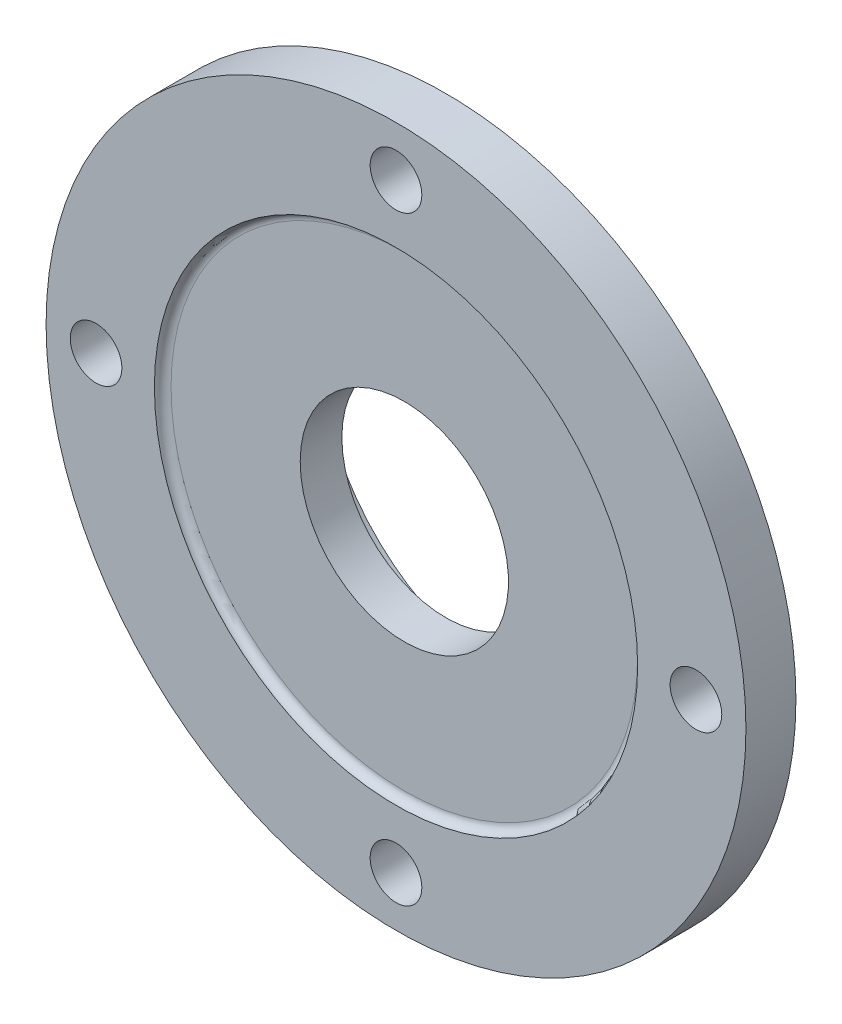
ISO-10303-21;
HEADER;
FILE_DESCRIPTION(('STEP AP214'),'2;1');
FILE_NAME('part.step','',(''),(''),'','','');
FILE_SCHEMA(('AUTOMOTIVE_DESIGN { 1 0 10303 214 1 1 1 1 }'));
ENDSEC;
DATA;
#1=APPLICATION_CONTEXT('core data for automotive mechanical design processes');
#2=APPLICATION_PROTOCOL_DEFINITION('international standard','automotive_design',2000,#1);
#3=PRODUCT_CONTEXT('',#1,'mechanical');
#4=PRODUCT('Part','Part','',(#3));
#5=PRODUCT_RELATED_PRODUCT_CATEGORY('part','',(#4));
#6=PRODUCT_DEFINITION_FORMATION('','',#4);
#7=PRODUCT_DEFINITION_CONTEXT('part definition',#1,'design');
#8=PRODUCT_DEFINITION('design','',#6,#7);
#9=PRODUCT_DEFINITION_SHAPE('','',#8);
#10=(LENGTH_UNIT() NAMED_UNIT(*) SI_UNIT(.MILLI.,.METRE.));
#11=(NAMED_UNIT(*) PLANE_ANGLE_UNIT() SI_UNIT($,.RADIAN.));
#12=(NAMED_UNIT(*) SI_UNIT($,.STERADIAN.) SOLID_ANGLE_UNIT());
#13=UNCERTAINTY_MEASURE_WITH_UNIT(LENGTH_MEASURE(1.E-05),#10,'distance_accuracy_value','');
#14=(GEOMETRIC_REPRESENTATION_CONTEXT(3) GLOBAL_UNCERTAINTY_ASSIGNED_CONTEXT((#13)) GLOBAL_UNIT_ASSIGNED_CONTEXT((#10,
#11,#12)) REPRESENTATION_CONTEXT('',''));
#15=CARTESIAN_POINT('',(0.,0.,0.));
#16=DIRECTION('',(0.,0.,1.));
#17=DIRECTION('',(1.,0.,0.));
#18=AXIS2_PLACEMENT_3D('',#15,#16,#17);
#19=CARTESIAN_POINT('',(0.,0.,6.));
#20=DIRECTION('',(0.,0.,1.));
#21=DIRECTION('',(1.,0.,0.));
#22=AXIS2_PLACEMENT_3D('',#19,#20,#21);
#23=PLANE('',#22);
#24=CARTESIAN_POINT('',(0.,0.,6.));
#25=DIRECTION('',(0.,0.,1.));
#26=DIRECTION('',(1.,0.,0.));
#27=AXIS2_PLACEMENT_3D('',#24,#25,#26);
#28=CIRCLE('',#27,29.);
#29=CARTESIAN_POINT('',(29.,0.,6.));
#30=VERTEX_POINT('',#29);
#31=EDGE_CURVE('E107',#30,#30,#28,.T.);
#32=ORIENTED_EDGE('',*,*,#31,.F.);
#33=EDGE_LOOP('',(#32));
#34=FACE_BOUND('',#33,.T.);
#35=CARTESIAN_POINT('',(-2.51386656396706E-13,-36.,6.));
#36=DIRECTION('',(0.,0.,1.));
#37=DIRECTION('',(1.,0.,0.));
#38=AXIS2_PLACEMENT_3D('',#35,#36,#37);
#39=CIRCLE('',#38,3.1);
#40=CARTESIAN_POINT('',(3.09999999999975,-36.,6.));
#41=VERTEX_POINT('',#40);
#42=EDGE_CURVE('E91',#41,#41,#39,.T.);
#43=ORIENTED_EDGE('',*,*,#42,.F.);
#44=EDGE_LOOP('',(#43));
#45=FACE_BOUND('',#44,.T.);
#46=CARTESIAN_POINT('',(0.,36.,6.));
#47=DIRECTION('',(0.,0.,1.));
#48=DIRECTION('',(1.,0.,0.));
#49=AXIS2_PLACEMENT_3D('',#46,#47,#48);
#50=CIRCLE('',#49,3.1);
#51=CARTESIAN_POINT('',(3.1,36.,6.));
#52=VERTEX_POINT('',#51);
#53=EDGE_CURVE('E75',#52,#52,#50,.T.);
#54=ORIENTED_EDGE('',*,*,#53,.F.);
#55=EDGE_LOOP('',(#54));
#56=FACE_BOUND('',#55,.T.);
#57=CARTESIAN_POINT('',(0.,0.,6.));
#58=DIRECTION('',(0.,0.,1.));
#59=DIRECTION('',(1.,0.,0.));
#60=AXIS2_PLACEMENT_3D('',#57,#58,#59);
#61=CIRCLE('',#60,42.);
#62=CARTESIAN_POINT('',(42.,0.,6.));
#63=VERTEX_POINT('',#62);
#64=EDGE_CURVE('E70',#63,#63,#61,.T.);
#65=ORIENTED_EDGE('',*,*,#64,.T.);
#66=EDGE_LOOP('',(#65));
#67=FACE_BOUND('',#66,.T.);
#68=CARTESIAN_POINT('',(36.,-1.25693328198353E-13,6.));
#69=DIRECTION('',(0.,0.,1.));
#70=DIRECTION('',(1.,0.,0.));
#71=AXIS2_PLACEMENT_3D('',#68,#69,#70);
#72=CIRCLE('',#71,3.1);
#73=CARTESIAN_POINT('',(39.1,-1.25693328198353E-13,6.));
#74=VERTEX_POINT('',#73);
#75=EDGE_CURVE('E83',#74,#74,#72,.T.);
#76=ORIENTED_EDGE('',*,*,#75,.F.);
#77=EDGE_LOOP('',(#76));
#78=FACE_BOUND('',#77,.T.);
#79=CARTESIAN_POINT('',(-36.,3.77079984595058E-13,6.));
#80=DIRECTION('',(0.,0.,1.));
#81=DIRECTION('',(1.,0.,0.));
#82=AXIS2_PLACEMENT_3D('',#79,#80,#81);
#83=CIRCLE('',#82,3.1);
#84=CARTESIAN_POINT('',(-32.9,3.77079984595058E-13,6.));
#85=VERTEX_POINT('',#84);
#86=EDGE_CURVE('E99',#85,#85,#83,.T.);
#87=ORIENTED_EDGE('',*,*,#86,.F.);
#88=EDGE_LOOP('',(#87));
#89=FACE_BOUND('',#88,.T.);
#90=ADVANCED_FACE('F45',(#34,#45,#56,#67,#78,#89),#23,.T.);
#91=CARTESIAN_POINT('',(0.,0.,0.));
#92=DIRECTION('',(0.,0.,1.));
#93=DIRECTION('',(1.,0.,0.));
#94=AXIS2_PLACEMENT_3D('',#91,#92,#93);
#95=PLANE('',#94);
#96=CARTESIAN_POINT('',(0.,0.,0.));
#97=DIRECTION('',(0.,0.,1.));
#98=DIRECTION('',(1.,0.,0.));
#99=AXIS2_PLACEMENT_3D('',#96,#97,#98);
#100=CIRCLE('',#99,29.);
#101=CARTESIAN_POINT('',(29.,0.,0.));
#102=VERTEX_POINT('',#101);
#103=EDGE_CURVE('E60',#102,#102,#100,.F.);
#104=ORIENTED_EDGE('',*,*,#103,.F.);
#105=EDGE_LOOP('',(#104));
#106=FACE_BOUND('',#105,.T.);
#107=CARTESIAN_POINT('',(0.,0.,0.));
#108=DIRECTION('',(0.,0.,1.));
#109=DIRECTION('',(1.,0.,0.));
#110=AXIS2_PLACEMENT_3D('',#107,#108,#109);
#111=CIRCLE('',#110,42.);
#112=CARTESIAN_POINT('',(42.,0.,0.));
#113=VERTEX_POINT('',#112);
#114=EDGE_CURVE('E71',#113,#113,#111,.T.);
#115=ORIENTED_EDGE('',*,*,#114,.F.);
#116=EDGE_LOOP('',(#115));
#117=FACE_BOUND('',#116,.T.);
#118=CARTESIAN_POINT('',(0.,36.,0.));
#119=DIRECTION('',(0.,0.,1.));
#120=DIRECTION('',(1.,0.,0.));
#121=AXIS2_PLACEMENT_3D('',#118,#119,#120);
#122=CIRCLE('',#121,3.1);
#123=CARTESIAN_POINT('',(3.1,36.,0.));
#124=VERTEX_POINT('',#123);
#125=EDGE_CURVE('E79',#124,#124,#122,.T.);
#126=ORIENTED_EDGE('',*,*,#125,.T.);
#127=EDGE_LOOP('',(#126));
#128=FACE_BOUND('',#127,.T.);
#129=CARTESIAN_POINT('',(36.,-1.25693328198353E-13,0.));
#130=DIRECTION('',(0.,0.,1.));
#131=DIRECTION('',(1.,0.,0.));
#132=AXIS2_PLACEMENT_3D('',#129,#130,#131);
#133=CIRCLE('',#132,3.1);
#134=CARTESIAN_POINT('',(39.1,-1.25693328198353E-13,0.));
#135=VERTEX_POINT('',#134);
#136=EDGE_CURVE('E87',#135,#135,#133,.T.);
#137=ORIENTED_EDGE('',*,*,#136,.T.);
#138=EDGE_LOOP('',(#137));
#139=FACE_BOUND('',#138,.T.);
#140=CARTESIAN_POINT('',(-2.51386656396706E-13,-36.,0.));
#141=DIRECTION('',(0.,0.,1.));
#142=DIRECTION('',(1.,0.,0.));
#143=AXIS2_PLACEMENT_3D('',#140,#141,#142);
#144=CIRCLE('',#143,3.1);
#145=CARTESIAN_POINT('',(3.09999999999975,-36.,0.));
#146=VERTEX_POINT('',#145);
#147=EDGE_CURVE('E95',#146,#146,#144,.T.);
#148=ORIENTED_EDGE('',*,*,#147,.T.);
#149=EDGE_LOOP('',(#148));
#150=FACE_BOUND('',#149,.T.);
#151=CARTESIAN_POINT('',(-36.,3.77079984595058E-13,0.));
#152=DIRECTION('',(0.,0.,1.));
#153=DIRECTION('',(1.,0.,0.));
#154=AXIS2_PLACEMENT_3D('',#151,#152,#153);
#155=CIRCLE('',#154,3.1);
#156=CARTESIAN_POINT('',(-32.9,3.77079984595058E-13,0.));
#157=VERTEX_POINT('',#156);
#158=EDGE_CURVE('E103',#157,#157,#155,.T.);
#159=ORIENTED_EDGE('',*,*,#158,.T.);
#160=EDGE_LOOP('',(#159));
#161=FACE_BOUND('',#160,.T.);
#162=ADVANCED_FACE('F153',(#106,#117,#128,#139,#150,#161),#95,.F.);
#163=CARTESIAN_POINT('',(0.,0.,6.));
#164=DIRECTION('',(0.,0.,-1.));
#165=DIRECTION('',(-1.,0.,0.));
#166=AXIS2_PLACEMENT_3D('',#163,#164,#165);
#167=CYLINDRICAL_SURFACE('',#166,42.);
#168=ORIENTED_EDGE('',*,*,#64,.F.);
#169=EDGE_LOOP('',(#168));
#170=FACE_BOUND('',#169,.T.);
#171=ORIENTED_EDGE('',*,*,#114,.T.);
#172=EDGE_LOOP('',(#171));
#173=FACE_BOUND('',#172,.T.);
#174=ADVANCED_FACE('F159',(#170,#173),#167,.T.);
#175=CARTESIAN_POINT('',(0.,36.,6.));
#176=DIRECTION('',(0.,0.,-1.));
#177=DIRECTION('',(-1.,0.,0.));
#178=AXIS2_PLACEMENT_3D('',#175,#176,#177);
#179=CYLINDRICAL_SURFACE('',#178,3.1);
#180=ORIENTED_EDGE('',*,*,#53,.T.);
#181=EDGE_LOOP('',(#180));
#182=FACE_BOUND('',#181,.T.);
#183=ORIENTED_EDGE('',*,*,#125,.F.);
#184=EDGE_LOOP('',(#183));
#185=FACE_BOUND('',#184,.T.);
#186=ADVANCED_FACE('F166',(#182,#185),#179,.F.);
#187=CARTESIAN_POINT('',(36.,-1.25693328198353E-13,6.));
#188=DIRECTION('',(0.,0.,-1.));
#189=DIRECTION('',(-1.,0.,0.));
#190=AXIS2_PLACEMENT_3D('',#187,#188,#189);
#191=CYLINDRICAL_SURFACE('',#190,3.1);
#192=ORIENTED_EDGE('',*,*,#75,.T.);
#193=EDGE_LOOP('',(#192));
#194=FACE_BOUND('',#193,.T.);
#195=ORIENTED_EDGE('',*,*,#136,.F.);
#196=EDGE_LOOP('',(#195));
#197=FACE_BOUND('',#196,.T.);
#198=ADVANCED_FACE('F173',(#194,#197),#191,.F.);
#199=CARTESIAN_POINT('',(-2.51386656396706E-13,-36.,6.));
#200=DIRECTION('',(0.,0.,-1.));
#201=DIRECTION('',(-1.,0.,0.));
#202=AXIS2_PLACEMENT_3D('',#199,#200,#201);
#203=CYLINDRICAL_SURFACE('',#202,3.1);
#204=ORIENTED_EDGE('',*,*,#42,.T.);
#205=EDGE_LOOP('',(#204));
#206=FACE_BOUND('',#205,.T.);
#207=ORIENTED_EDGE('',*,*,#147,.F.);
#208=EDGE_LOOP('',(#207));
#209=FACE_BOUND('',#208,.T.);
#210=ADVANCED_FACE('F188',(#206,#209),#203,.F.);
#211=CARTESIAN_POINT('',(-36.,3.77079984595058E-13,6.));
#212=DIRECTION('',(0.,0.,-1.));
#213=DIRECTION('',(-1.,0.,0.));
#214=AXIS2_PLACEMENT_3D('',#211,#212,#213);
#215=CYLINDRICAL_SURFACE('',#214,3.1);
#216=ORIENTED_EDGE('',*,*,#86,.T.);
#217=EDGE_LOOP('',(#216));
#218=FACE_BOUND('',#217,.T.);
#219=ORIENTED_EDGE('',*,*,#158,.F.);
#220=EDGE_LOOP('',(#219));
#221=FACE_BOUND('',#220,.T.);
#222=ADVANCED_FACE('F137',(#218,#221),#215,.F.);
#223=CARTESIAN_POINT('',(0.,0.,5.));
#224=DIRECTION('',(0.,0.,1.));
#225=DIRECTION('',(1.,0.,0.));
#226=AXIS2_PLACEMENT_3D('',#223,#224,#225);
#227=PLANE('',#226);
#228=CARTESIAN_POINT('',(0.,0.,5.));
#229=DIRECTION('',(0.,0.,1.));
#230=DIRECTION('',(1.,0.,0.));
#231=AXIS2_PLACEMENT_3D('',#228,#229,#230);
#232=CIRCLE('',#231,12.5);
#233=CARTESIAN_POINT('',(-12.5,0.,5.));
#234=VERTEX_POINT('',#233);
#235=EDGE_CURVE('E50',#234,#234,#232,.T.);
#236=ORIENTED_EDGE('',*,*,#235,.F.);
#237=EDGE_LOOP('',(#236));
#238=FACE_BOUND('',#237,.T.);
#239=CARTESIAN_POINT('',(0.,0.,5.));
#240=DIRECTION('',(0.,0.,1.));
#241=DIRECTION('',(1.,0.,0.));
#242=AXIS2_PLACEMENT_3D('',#239,#240,#241);
#243=CIRCLE('',#242,28.);
#244=CARTESIAN_POINT('',(28.,0.,5.));
#245=VERTEX_POINT('',#244);
#246=EDGE_CURVE('E66',#245,#245,#243,.T.);
#247=ORIENTED_EDGE('',*,*,#246,.T.);
#248=EDGE_LOOP('',(#247));
#249=FACE_BOUND('',#248,.T.);
#250=ADVANCED_FACE('F133',(#238,#249),#227,.T.);
#251=CARTESIAN_POINT('',(0.,0.,6.));
#252=DIRECTION('',(0.,0.,1.));
#253=DIRECTION('',(1.,0.,0.));
#254=AXIS2_PLACEMENT_3D('',#251,#252,#253);
#255=TOROIDAL_SURFACE('',#254,28.,1.);
#256=ORIENTED_EDGE('',*,*,#31,.T.);
#257=EDGE_LOOP('',(#256));
#258=FACE_BOUND('',#257,.T.);
#259=ORIENTED_EDGE('',*,*,#246,.F.);
#260=EDGE_LOOP('',(#259));
#261=FACE_BOUND('',#260,.T.);
#262=ADVANCED_FACE('F136',(#258,#261),#255,.F.);
#263=CARTESIAN_POINT('',(0.,0.,-8.3));
#264=DIRECTION('',(0.,0.,-1.));
#265=DIRECTION('',(-1.,0.,0.));
#266=AXIS2_PLACEMENT_3D('',#263,#264,#265);
#267=PLANE('',#266);
#268=CARTESIAN_POINT('',(0.,0.,-8.3));
#269=DIRECTION('',(0.,0.,-1.));
#270=DIRECTION('',(-1.,0.,0.));
#271=AXIS2_PLACEMENT_3D('',#268,#269,#270);
#272=CIRCLE('',#271,29.);
#273=CARTESIAN_POINT('',(29.,0.,-8.3));
#274=VERTEX_POINT('',#273);
#275=EDGE_CURVE('E114',#274,#274,#272,.T.);
#276=ORIENTED_EDGE('',*,*,#275,.T.);
#277=EDGE_LOOP('',(#276));
#278=FACE_BOUND('',#277,.T.);
#279=CARTESIAN_POINT('',(0.,0.,-8.3));
#280=DIRECTION('',(0.,0.,-1.));
#281=DIRECTION('',(-1.,0.,0.));
#282=AXIS2_PLACEMENT_3D('',#279,#280,#281);
#283=CIRCLE('',#282,23.5);
#284=CARTESIAN_POINT('',(23.5,0.,-8.3));
#285=VERTEX_POINT('',#284);
#286=EDGE_CURVE('E118',#285,#285,#283,.T.);
#287=ORIENTED_EDGE('',*,*,#286,.F.);
#288=EDGE_LOOP('',(#287));
#289=FACE_BOUND('',#288,.T.);
#290=ADVANCED_FACE('F142',(#278,#289),#267,.T.);
#291=CARTESIAN_POINT('',(0.,0.,-8.3));
#292=DIRECTION('',(0.,0.,1.));
#293=DIRECTION('',(1.,0.,0.));
#294=AXIS2_PLACEMENT_3D('',#291,#292,#293);
#295=CYLINDRICAL_SURFACE('',#294,29.);
#296=CARTESIAN_POINT('',(29.,0.,-8.3));
#297=CARTESIAN_POINT('',(29.,0.,-8.21354166666667));
#298=CARTESIAN_POINT('',(29.,0.,-8.12708333333333));
#299=CARTESIAN_POINT('',(29.,0.,-7.95416666666667));
#300=CARTESIAN_POINT('',(29.,0.,-7.86770833333333));
#301=CARTESIAN_POINT('',(29.,0.,-7.69479166666667));
#302=CARTESIAN_POINT('',(29.,0.,-7.60833333333333));
#303=CARTESIAN_POINT('',(29.,0.,-7.43541666666667));
#304=CARTESIAN_POINT('',(29.,0.,-7.34895833333333));
#305=CARTESIAN_POINT('',(29.,0.,-7.17604166666667));
#306=CARTESIAN_POINT('',(29.,0.,-7.08958333333333));
#307=CARTESIAN_POINT('',(29.,0.,-6.91666666666667));
#308=CARTESIAN_POINT('',(29.,0.,-6.83020833333333));
#309=CARTESIAN_POINT('',(29.,0.,-6.65729166666667));
#310=CARTESIAN_POINT('',(29.,0.,-6.57083333333333));
#311=CARTESIAN_POINT('',(29.,0.,-6.39791666666667));
#312=CARTESIAN_POINT('',(29.,0.,-6.31145833333333));
#313=CARTESIAN_POINT('',(29.,0.,-6.13854166666667));
#314=CARTESIAN_POINT('',(29.,0.,-6.05208333333333));
#315=CARTESIAN_POINT('',(29.,0.,-5.87916666666667));
#316=CARTESIAN_POINT('',(29.,0.,-5.79270833333333));
#317=CARTESIAN_POINT('',(29.,0.,-5.61979166666667));
#318=CARTESIAN_POINT('',(29.,0.,-5.53333333333333));
#319=CARTESIAN_POINT('',(29.,0.,-5.36041666666667));
#320=CARTESIAN_POINT('',(29.,0.,-5.27395833333333));
#321=CARTESIAN_POINT('',(29.,0.,-5.10104166666667));
#322=CARTESIAN_POINT('',(29.,0.,-5.01458333333333));
#323=CARTESIAN_POINT('',(29.,0.,-4.84166666666667));
#324=CARTESIAN_POINT('',(29.,0.,-4.75520833333333));
#325=CARTESIAN_POINT('',(29.,0.,-4.58229166666667));
#326=CARTESIAN_POINT('',(29.,0.,-4.49583333333333));
#327=CARTESIAN_POINT('',(29.,0.,-4.32291666666667));
#328=CARTESIAN_POINT('',(29.,0.,-4.23645833333333));
#329=CARTESIAN_POINT('',(29.,0.,-4.06354166666667));
#330=CARTESIAN_POINT('',(29.,0.,-3.97708333333333));
#331=CARTESIAN_POINT('',(29.,0.,-3.80416666666667));
#332=CARTESIAN_POINT('',(29.,0.,-3.71770833333333));
#333=CARTESIAN_POINT('',(29.,0.,-3.54479166666667));
#334=CARTESIAN_POINT('',(29.,0.,-3.45833333333333));
#335=CARTESIAN_POINT('',(29.,0.,-3.28541666666667));
#336=CARTESIAN_POINT('',(29.,0.,-3.19895833333333));
#337=CARTESIAN_POINT('',(29.,0.,-3.02604166666667));
#338=CARTESIAN_POINT('',(29.,0.,-2.93958333333333));
#339=CARTESIAN_POINT('',(29.,0.,-2.76666666666667));
#340=CARTESIAN_POINT('',(29.,0.,-2.68020833333333));
#341=CARTESIAN_POINT('',(29.,0.,-2.50729166666667));
#342=CARTESIAN_POINT('',(29.,0.,-2.42083333333333));
#343=CARTESIAN_POINT('',(29.,0.,-2.24791666666667));
#344=CARTESIAN_POINT('',(29.,0.,-2.16145833333333));
#345=CARTESIAN_POINT('',(29.,0.,-1.98854166666667));
#346=CARTESIAN_POINT('',(29.,0.,-1.90208333333333));
#347=CARTESIAN_POINT('',(29.,0.,-1.72916666666667));
#348=CARTESIAN_POINT('',(29.,0.,-1.64270833333333));
#349=CARTESIAN_POINT('',(29.,0.,-1.46979166666667));
#350=CARTESIAN_POINT('',(29.,0.,-1.38333333333333));
#351=CARTESIAN_POINT('',(29.,0.,-1.21041666666667));
#352=CARTESIAN_POINT('',(29.,0.,-1.12395833333333));
#353=CARTESIAN_POINT('',(29.,0.,-0.951041666666667));
#354=CARTESIAN_POINT('',(29.,0.,-0.864583333333333));
#355=CARTESIAN_POINT('',(29.,0.,-0.691666666666667));
#356=CARTESIAN_POINT('',(29.,0.,-0.605208333333333));
#357=CARTESIAN_POINT('',(29.,0.,-0.432291666666666));
#358=CARTESIAN_POINT('',(29.,0.,-0.345833333333333));
#359=CARTESIAN_POINT('',(29.,0.,-0.172916666666666));
#360=CARTESIAN_POINT('',(29.,0.,-0.086458333333333));
#361=CARTESIAN_POINT('',(29.,0.,0.));
#362=B_SPLINE_CURVE_WITH_KNOTS('',3,(#296,#297,#298,#299,#300,#301,#302,#303,#304,#305,#306,
#307,#308,#309,#310,#311,#312,#313,#314,#315,#316,#317,#318,#319,#320,#321,#322,#323,#324,#325,
#326,#327,#328,#329,#330,#331,#332,#333,#334,#335,#336,#337,#338,#339,#340,#341,#342,#343,#344,
#345,#346,#347,#348,#349,#350,#351,#352,#353,#354,#355,#356,#357,#358,#359,#360,#361),
.UNSPECIFIED.,.F.,.F.,(4,2,2,2,2,2,2,2,2,2,2,2,2,2,2,2,2,2,2,2,2,2,2,2,2,2,2,2,2,2,2,2,4),(0.,
0.259374999999999,0.518749999999999,0.778124999999999,1.0375,1.296875,1.55625,1.815625,2.075,
2.334375,2.59375,2.853125,3.1125,3.371875,3.63125,3.890625,4.15,4.409375,4.66875,4.928125,
5.1875,5.446875,5.70625,5.965625,6.225,6.484375,6.74375,7.003125,7.2625,7.521875,7.78125,
8.040625,8.3),.UNSPECIFIED.);
#363=EDGE_CURVE('BSEAM149',#274,#102,#362,.T.);
#364=ORIENTED_EDGE('',*,*,#275,.F.);
#365=ORIENTED_EDGE('',*,*,#103,.T.);
#366=ORIENTED_EDGE('',*,*,#363,.T.);
#367=ORIENTED_EDGE('',*,*,#363,.F.);
#368=EDGE_LOOP('',(#364,#366,#365,#367));
#369=FACE_BOUND('',#368,.T.);
#370=ADVANCED_FACE('F149',(#369),#295,.T.);
#371=CARTESIAN_POINT('',(0.,0.,-8.3));
#372=DIRECTION('',(0.,0.,1.));
#373=DIRECTION('',(1.,0.,0.));
#374=AXIS2_PLACEMENT_3D('',#371,#372,#373);
#375=CYLINDRICAL_SURFACE('',#374,23.5);
#376=CARTESIAN_POINT('',(0.,0.,-0.999999999999935));
#377=DIRECTION('',(0.,0.,1.));
#378=DIRECTION('',(1.,0.,0.));
#379=AXIS2_PLACEMENT_3D('',#376,#377,#378);
#380=CIRCLE('',#379,23.5);
#381=CARTESIAN_POINT('',(23.5,0.,-0.999999999999936));
#382=VERTEX_POINT('',#381);
#383=EDGE_CURVE('E10',#382,#382,#380,.T.);
#384=CARTESIAN_POINT('',(23.5,0.,-0.999999999999936));
#385=CARTESIAN_POINT('',(23.5,0.,-1.0760416666666));
#386=CARTESIAN_POINT('',(23.5,0.,-1.15208333333327));
#387=CARTESIAN_POINT('',(23.5,0.,-1.30416666666661));
#388=CARTESIAN_POINT('',(23.5,0.,-1.38020833333327));
#389=CARTESIAN_POINT('',(23.5,0.,-1.53229166666661));
#390=CARTESIAN_POINT('',(23.5,0.,-1.60833333333327));
#391=CARTESIAN_POINT('',(23.5,0.,-1.76041666666661));
#392=CARTESIAN_POINT('',(23.5,0.,-1.83645833333328));
#393=CARTESIAN_POINT('',(23.5,0.,-1.98854166666661));
#394=CARTESIAN_POINT('',(23.5,0.,-2.06458333333328));
#395=CARTESIAN_POINT('',(23.5,0.,-2.21666666666661));
#396=CARTESIAN_POINT('',(23.5,0.,-2.29270833333328));
#397=CARTESIAN_POINT('',(23.5,0.,-2.44479166666662));
#398=CARTESIAN_POINT('',(23.5,0.,-2.52083333333328));
#399=CARTESIAN_POINT('',(23.5,0.,-2.67291666666662));
#400=CARTESIAN_POINT('',(23.5,0.,-2.74895833333328));
#401=CARTESIAN_POINT('',(23.5,0.,-2.90104166666662));
#402=CARTESIAN_POINT('',(23.5,0.,-2.97708333333329));
#403=CARTESIAN_POINT('',(23.5,0.,-3.12916666666662));
#404=CARTESIAN_POINT('',(23.5,0.,-3.20520833333329));
#405=CARTESIAN_POINT('',(23.5,0.,-3.35729166666662));
#406=CARTESIAN_POINT('',(23.5,0.,-3.43333333333329));
#407=CARTESIAN_POINT('',(23.5,0.,-3.58541666666663));
#408=CARTESIAN_POINT('',(23.5,0.,-3.66145833333329));
#409=CARTESIAN_POINT('',(23.5,0.,-3.81354166666663));
#410=CARTESIAN_POINT('',(23.5,0.,-3.88958333333329));
#411=CARTESIAN_POINT('',(23.5,0.,-4.04166666666663));
#412=CARTESIAN_POINT('',(23.5,0.,-4.1177083333333));
#413=CARTESIAN_POINT('',(23.5,0.,-4.26979166666663));
#414=CARTESIAN_POINT('',(23.5,0.,-4.3458333333333));
#415=CARTESIAN_POINT('',(23.5,0.,-4.49791666666663));
#416=CARTESIAN_POINT('',(23.5,0.,-4.5739583333333));
#417=CARTESIAN_POINT('',(23.5,0.,-4.72604166666663));
#418=CARTESIAN_POINT('',(23.5,0.,-4.8020833333333));
#419=CARTESIAN_POINT('',(23.5,0.,-4.95416666666664));
#420=CARTESIAN_POINT('',(23.5,0.,-5.0302083333333));
#421=CARTESIAN_POINT('',(23.5,0.,-5.18229166666664));
#422=CARTESIAN_POINT('',(23.5,0.,-5.25833333333331));
#423=CARTESIAN_POINT('',(23.5,0.,-5.41041666666664));
#424=CARTESIAN_POINT('',(23.5,0.,-5.48645833333331));
#425=CARTESIAN_POINT('',(23.5,0.,-5.63854166666664));
#426=CARTESIAN_POINT('',(23.5,0.,-5.71458333333331));
#427=CARTESIAN_POINT('',(23.5,0.,-5.86666666666664));
#428=CARTESIAN_POINT('',(23.5,0.,-5.94270833333331));
#429=CARTESIAN_POINT('',(23.5,0.,-6.09479166666665));
#430=CARTESIAN_POINT('',(23.5,0.,-6.17083333333331));
#431=CARTESIAN_POINT('',(23.5,0.,-6.32291666666665));
#432=CARTESIAN_POINT('',(23.5,0.,-6.39895833333332));
#433=CARTESIAN_POINT('',(23.5,0.,-6.55104166666665));
#434=CARTESIAN_POINT('',(23.5,0.,-6.62708333333332));
#435=CARTESIAN_POINT('',(23.5,0.,-6.77916666666665));
#436=CARTESIAN_POINT('',(23.5,0.,-6.85520833333332));
#437=CARTESIAN_POINT('',(23.5,0.,-7.00729166666665));
#438=CARTESIAN_POINT('',(23.5,0.,-7.08333333333332));
#439=CARTESIAN_POINT('',(23.5,0.,-7.23541666666666));
#440=CARTESIAN_POINT('',(23.5,0.,-7.31145833333332));
#441=CARTESIAN_POINT('',(23.5,0.,-7.46354166666666));
#442=CARTESIAN_POINT('',(23.5,0.,-7.53958333333333));
#443=CARTESIAN_POINT('',(23.5,0.,-7.69166666666666));
#444=CARTESIAN_POINT('',(23.5,0.,-7.76770833333333));
#445=CARTESIAN_POINT('',(23.5,0.,-7.91979166666666));
#446=CARTESIAN_POINT('',(23.5,0.,-7.99583333333333));
#447=CARTESIAN_POINT('',(23.5,0.,-8.14791666666666));
#448=CARTESIAN_POINT('',(23.5,0.,-8.22395833333333));
#449=CARTESIAN_POINT('',(23.5,0.,-8.3));
#450=B_SPLINE_CURVE_WITH_KNOTS('',3,(#384,#385,#386,#387,#388,#389,#390,#391,#392,#393,#394,
#395,#396,#397,#398,#399,#400,#401,#402,#403,#404,#405,#406,#407,#408,#409,#410,#411,#412,#413,
#414,#415,#416,#417,#418,#419,#420,#421,#422,#423,#424,#425,#426,#427,#428,#429,#430,#431,#432,
#433,#434,#435,#436,#437,#438,#439,#440,#441,#442,#443,#444,#445,#446,#447,#448,#449),
.UNSPECIFIED.,.F.,.F.,(4,2,2,2,2,2,2,2,2,2,2,2,2,2,2,2,2,2,2,2,2,2,2,2,2,2,2,2,2,2,2,2,4),(0.,
0.228125000000002,0.456250000000004,0.684375000000006,0.912500000000008,1.14062500000001,
1.36875000000001,1.59687500000001,1.82500000000002,2.05312500000002,2.28125000000002,
2.50937500000002,2.73750000000002,2.96562500000003,3.19375000000003,3.42187500000003,
3.65000000000003,3.87812500000003,4.10625000000004,4.33437500000004,4.56250000000004,
4.79062500000004,5.01875000000004,5.24687500000005,5.47500000000005,5.70312500000005,
5.93125000000005,6.15937500000005,6.38750000000006,6.61562500000006,6.84375000000006,
7.07187500000006,7.30000000000006),.UNSPECIFIED.);
#451=EDGE_CURVE('BSEAM238',#382,#285,#450,.T.);
#452=ORIENTED_EDGE('',*,*,#383,.T.);
#453=ORIENTED_EDGE('',*,*,#286,.T.);
#454=ORIENTED_EDGE('',*,*,#451,.T.);
#455=ORIENTED_EDGE('',*,*,#451,.F.);
#456=EDGE_LOOP('',(#452,#454,#453,#455));
#457=FACE_BOUND('',#456,.T.);
#458=ADVANCED_FACE('F238',(#457),#375,.F.);
#459=CARTESIAN_POINT('',(0.,0.,0.));
#460=DIRECTION('',(0.,0.,-1.));
#461=DIRECTION('',(-1.,0.,0.));
#462=AXIS2_PLACEMENT_3D('',#459,#460,#461);
#463=CIRCLE('',#462,12.5);
#464=CARTESIAN_POINT('',(-12.5,0.,0.));
#465=VERTEX_POINT('',#464);
#466=EDGE_CURVE('E122',#465,#465,#463,.T.);
#467=ORIENTED_EDGE('',*,*,#466,.F.);
#468=EDGE_LOOP('',(#467));
#469=FACE_BOUND('',#468,.T.);
#470=CARTESIAN_POINT('',(0.,0.,0.));
#471=DIRECTION('',(0.,0.,1.));
#472=DIRECTION('',(1.,0.,0.));
#473=AXIS2_PLACEMENT_3D('',#470,#471,#472);
#474=CIRCLE('',#473,22.5000000000001);
#475=CARTESIAN_POINT('',(22.5000000000001,0.,0.));
#476=VERTEX_POINT('',#475);
#477=EDGE_CURVE('E55',#476,#476,#474,.F.);
#478=ORIENTED_EDGE('',*,*,#477,.T.);
#479=EDGE_LOOP('',(#478));
#480=FACE_BOUND('',#479,.T.);
#481=ADVANCED_FACE('F162',(#469,#480),#95,.F.);
#482=CARTESIAN_POINT('',(0.,0.,0.));
#483=DIRECTION('',(0.,0.,-1.));
#484=DIRECTION('',(-1.,0.,0.));
#485=AXIS2_PLACEMENT_3D('',#482,#483,#484);
#486=CONICAL_SURFACE('',#485,22.5000000000001,0.785398163397454);
#487=ORIENTED_EDGE('',*,*,#383,.F.);
#488=EDGE_LOOP('',(#487));
#489=FACE_BOUND('',#488,.T.);
#490=ORIENTED_EDGE('',*,*,#477,.F.);
#491=EDGE_LOOP('',(#490));
#492=FACE_BOUND('',#491,.T.);
#493=ADVANCED_FACE('F48',(#489,#492),#486,.F.);
#494=CARTESIAN_POINT('',(0.,0.,8.3));
#495=DIRECTION('',(0.,0.,-1.));
#496=DIRECTION('',(-1.,0.,0.));
#497=AXIS2_PLACEMENT_3D('',#494,#495,#496);
#498=CYLINDRICAL_SURFACE('',#497,12.5);
#499=CARTESIAN_POINT('',(-12.5,0.,5.));
#500=CARTESIAN_POINT('',(-12.5,0.,4.94791666666667));
#501=CARTESIAN_POINT('',(-12.5,0.,4.89583333333333));
#502=CARTESIAN_POINT('',(-12.5,0.,4.79166666666667));
#503=CARTESIAN_POINT('',(-12.5,0.,4.73958333333333));
#504=CARTESIAN_POINT('',(-12.5,0.,4.63541666666667));
#505=CARTESIAN_POINT('',(-12.5,0.,4.58333333333333));
#506=CARTESIAN_POINT('',(-12.5,0.,4.47916666666667));
#507=CARTESIAN_POINT('',(-12.5,0.,4.42708333333333));
#508=CARTESIAN_POINT('',(-12.5,0.,4.32291666666667));
#509=CARTESIAN_POINT('',(-12.5,0.,4.27083333333333));
#510=CARTESIAN_POINT('',(-12.5,0.,4.16666666666667));
#511=CARTESIAN_POINT('',(-12.5,0.,4.11458333333333));
#512=CARTESIAN_POINT('',(-12.5,0.,4.01041666666667));
#513=CARTESIAN_POINT('',(-12.5,0.,3.95833333333333));
#514=CARTESIAN_POINT('',(-12.5,0.,3.85416666666667));
#515=CARTESIAN_POINT('',(-12.5,0.,3.80208333333333));
#516=CARTESIAN_POINT('',(-12.5,0.,3.69791666666667));
#517=CARTESIAN_POINT('',(-12.5,0.,3.64583333333333));
#518=CARTESIAN_POINT('',(-12.5,0.,3.54166666666667));
#519=CARTESIAN_POINT('',(-12.5,0.,3.48958333333333));
#520=CARTESIAN_POINT('',(-12.5,0.,3.38541666666667));
#521=CARTESIAN_POINT('',(-12.5,0.,3.33333333333333));
#522=CARTESIAN_POINT('',(-12.5,0.,3.22916666666667));
#523=CARTESIAN_POINT('',(-12.5,0.,3.17708333333333));
#524=CARTESIAN_POINT('',(-12.5,0.,3.07291666666667));
#525=CARTESIAN_POINT('',(-12.5,0.,3.02083333333333));
#526=CARTESIAN_POINT('',(-12.5,0.,2.91666666666667));
#527=CARTESIAN_POINT('',(-12.5,0.,2.86458333333333));
#528=CARTESIAN_POINT('',(-12.5,0.,2.76041666666667));
#529=CARTESIAN_POINT('',(-12.5,0.,2.70833333333333));
#530=CARTESIAN_POINT('',(-12.5,0.,2.60416666666667));
#531=CARTESIAN_POINT('',(-12.5,0.,2.55208333333333));
#532=CARTESIAN_POINT('',(-12.5,0.,2.44791666666667));
#533=CARTESIAN_POINT('',(-12.5,0.,2.39583333333333));
#534=CARTESIAN_POINT('',(-12.5,0.,2.29166666666667));
#535=CARTESIAN_POINT('',(-12.5,0.,2.23958333333333));
#536=CARTESIAN_POINT('',(-12.5,0.,2.13541666666667));
#537=CARTESIAN_POINT('',(-12.5,0.,2.08333333333333));
#538=CARTESIAN_POINT('',(-12.5,0.,1.97916666666667));
#539=CARTESIAN_POINT('',(-12.5,0.,1.92708333333333));
#540=CARTESIAN_POINT('',(-12.5,0.,1.82291666666667));
#541=CARTESIAN_POINT('',(-12.5,0.,1.77083333333333));
#542=CARTESIAN_POINT('',(-12.5,0.,1.66666666666667));
#543=CARTESIAN_POINT('',(-12.5,0.,1.61458333333333));
#544=CARTESIAN_POINT('',(-12.5,0.,1.51041666666667));
#545=CARTESIAN_POINT('',(-12.5,0.,1.45833333333333));
#546=CARTESIAN_POINT('',(-12.5,0.,1.35416666666667));
#547=CARTESIAN_POINT('',(-12.5,0.,1.30208333333333));
#548=CARTESIAN_POINT('',(-12.5,0.,1.19791666666667));
#549=CARTESIAN_POINT('',(-12.5,0.,1.14583333333333));
#550=CARTESIAN_POINT('',(-12.5,0.,1.04166666666667));
#551=CARTESIAN_POINT('',(-12.5,0.,0.989583333333333));
#552=CARTESIAN_POINT('',(-12.5,0.,0.885416666666666));
#553=CARTESIAN_POINT('',(-12.5,0.,0.833333333333332));
#554=CARTESIAN_POINT('',(-12.5,0.,0.729166666666666));
#555=CARTESIAN_POINT('',(-12.5,0.,0.677083333333333));
#556=CARTESIAN_POINT('',(-12.5,0.,0.572916666666667));
#557=CARTESIAN_POINT('',(-12.5,0.,0.520833333333334));
#558=CARTESIAN_POINT('',(-12.5,0.,0.416666666666667));
#559=CARTESIAN_POINT('',(-12.5,0.,0.364583333333334));
#560=CARTESIAN_POINT('',(-12.5,0.,0.260416666666667));
#561=CARTESIAN_POINT('',(-12.5,0.,0.208333333333333));
#562=CARTESIAN_POINT('',(-12.5,0.,0.104166666666667));
#563=CARTESIAN_POINT('',(-12.5,0.,0.0520833333333334));
#564=CARTESIAN_POINT('',(-12.5,0.,0.));
#565=B_SPLINE_CURVE_WITH_KNOTS('',3,(#499,#500,#501,#502,#503,#504,#505,#506,#507,#508,#509,
#510,#511,#512,#513,#514,#515,#516,#517,#518,#519,#520,#521,#522,#523,#524,#525,#526,#527,#528,
#529,#530,#531,#532,#533,#534,#535,#536,#537,#538,#539,#540,#541,#542,#543,#544,#545,#546,#547,
#548,#549,#550,#551,#552,#553,#554,#555,#556,#557,#558,#559,#560,#561,#562,#563,#564),
.UNSPECIFIED.,.F.,.F.,(4,2,2,2,2,2,2,2,2,2,2,2,2,2,2,2,2,2,2,2,2,2,2,2,2,2,2,2,2,2,2,2,4),(0.,
0.15625,0.3125,0.46875,0.625,0.781249999999999,0.937499999999999,1.09375,1.25,1.40625,1.5625,
1.71875,1.875,2.03125,2.1875,2.34375,2.5,2.65625,2.8125,2.96875,3.125,3.28125,3.4375,3.59375,
3.75,3.90625,4.0625,4.21875,4.375,4.53125,4.6875,4.84375,5.),.UNSPECIFIED.);
#566=EDGE_CURVE('BSEAM131',#234,#465,#565,.T.);
#567=ORIENTED_EDGE('',*,*,#235,.T.);
#568=ORIENTED_EDGE('',*,*,#466,.T.);
#569=ORIENTED_EDGE('',*,*,#566,.T.);
#570=ORIENTED_EDGE('',*,*,#566,.F.);
#571=EDGE_LOOP('',(#567,#569,#568,#570));
#572=FACE_BOUND('',#571,.T.);
#573=ADVANCED_FACE('F131',(#572),#498,.F.);
#574=CLOSED_SHELL('',(#90,#162,#174,#186,#198,#210,#222,#250,#262,#290,#370,#458,#481,#493,#573));
#575=MANIFOLD_SOLID_BREP('B2',#574);
#576=ADVANCED_BREP_SHAPE_REPRESENTATION('',(#18,#575),#14);
#577=SHAPE_DEFINITION_REPRESENTATION(#9,#576);
ENDSEC;
END-ISO-10303-21;
